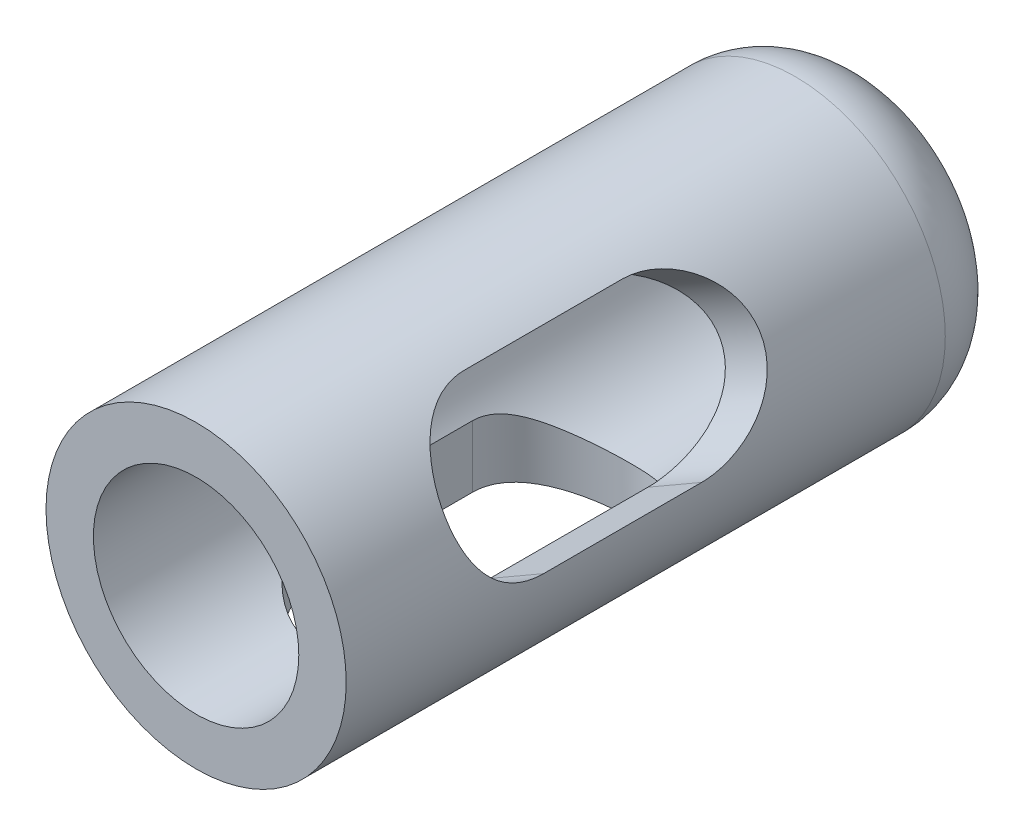
ISO-10303-21;
HEADER;
FILE_DESCRIPTION(('STEP AP214'),'2;1');
FILE_NAME('part.step','',(''),(''),'','','');
FILE_SCHEMA(('AUTOMOTIVE_DESIGN { 1 0 10303 214 1 1 1 1 }'));
ENDSEC;
DATA;
#1=APPLICATION_CONTEXT('core data for automotive mechanical design processes');
#2=APPLICATION_PROTOCOL_DEFINITION('international standard','automotive_design',2000,#1);
#3=PRODUCT_CONTEXT('',#1,'mechanical');
#4=PRODUCT('Part','Part','',(#3));
#5=PRODUCT_RELATED_PRODUCT_CATEGORY('part','',(#4));
#6=PRODUCT_DEFINITION_FORMATION('','',#4);
#7=PRODUCT_DEFINITION_CONTEXT('part definition',#1,'design');
#8=PRODUCT_DEFINITION('design','',#6,#7);
#9=PRODUCT_DEFINITION_SHAPE('','',#8);
#10=(LENGTH_UNIT() NAMED_UNIT(*) SI_UNIT(.MILLI.,.METRE.));
#11=(NAMED_UNIT(*) PLANE_ANGLE_UNIT() SI_UNIT($,.RADIAN.));
#12=(NAMED_UNIT(*) SI_UNIT($,.STERADIAN.) SOLID_ANGLE_UNIT());
#13=UNCERTAINTY_MEASURE_WITH_UNIT(LENGTH_MEASURE(1.E-05),#10,'distance_accuracy_value','');
#14=(GEOMETRIC_REPRESENTATION_CONTEXT(3) GLOBAL_UNCERTAINTY_ASSIGNED_CONTEXT((#13)) GLOBAL_UNIT_ASSIGNED_CONTEXT((#10,
#11,#12)) REPRESENTATION_CONTEXT('',''));
#15=CARTESIAN_POINT('',(0.,0.,0.));
#16=DIRECTION('',(0.,0.,1.));
#17=DIRECTION('',(1.,0.,0.));
#18=AXIS2_PLACEMENT_3D('',#15,#16,#17);
#19=CARTESIAN_POINT('',(0.,0.,17.));
#20=DIRECTION('',(0.,0.,1.));
#21=DIRECTION('',(1.,0.,0.));
#22=AXIS2_PLACEMENT_3D('',#19,#20,#21);
#23=PLANE('',#22);
#24=CARTESIAN_POINT('',(0.,0.,17.));
#25=DIRECTION('',(0.,0.,1.));
#26=DIRECTION('',(1.,0.,0.));
#27=AXIS2_PLACEMENT_3D('',#24,#25,#26);
#28=CIRCLE('',#27,3.8);
#29=CARTESIAN_POINT('',(3.8,0.,17.));
#30=VERTEX_POINT('',#29);
#31=EDGE_CURVE('E164',#30,#30,#28,.T.);
#32=ORIENTED_EDGE('',*,*,#31,.T.);
#33=EDGE_LOOP('',(#32));
#34=FACE_BOUND('',#33,.T.);
#35=CARTESIAN_POINT('',(0.,0.,17.));
#36=DIRECTION('',(0.,0.,1.));
#37=DIRECTION('',(1.,0.,0.));
#38=AXIS2_PLACEMENT_3D('',#35,#36,#37);
#39=CIRCLE('',#38,2.6);
#40=CARTESIAN_POINT('',(2.6,0.,17.));
#41=VERTEX_POINT('',#40);
#42=EDGE_CURVE('E232',#41,#41,#39,.T.);
#43=ORIENTED_EDGE('',*,*,#42,.F.);
#44=EDGE_LOOP('',(#43));
#45=FACE_BOUND('',#44,.T.);
#46=ADVANCED_FACE('F33',(#34,#45),#23,.T.);
#47=CARTESIAN_POINT('',(0.,0.,17.));
#48=DIRECTION('',(0.,0.,-1.));
#49=DIRECTION('',(-1.,0.,0.));
#50=AXIS2_PLACEMENT_3D('',#47,#48,#49);
#51=CYLINDRICAL_SURFACE('',#50,3.8);
#52=CARTESIAN_POINT('',(0.,0.,1.83303027798234));
#53=DIRECTION('',(0.,0.,-1.));
#54=DIRECTION('',(-1.,0.,0.));
#55=AXIS2_PLACEMENT_3D('',#52,#53,#54);
#56=CIRCLE('',#55,3.8);
#57=CARTESIAN_POINT('',(-3.8,0.,1.83303027798234));
#58=VERTEX_POINT('',#57);
#59=EDGE_CURVE('E11',#58,#58,#56,.F.);
#60=ORIENTED_EDGE('',*,*,#59,.T.);
#61=EDGE_LOOP('',(#60));
#62=FACE_BOUND('',#61,.T.);
#63=CARTESIAN_POINT('',(1.79821371592663,3.34760024970924,8.));
#64=CARTESIAN_POINT('',(1.79819423842391,3.34760041602711,7.94805796321496));
#65=CARTESIAN_POINT('',(1.80030960150448,3.34647420937593,7.89612535945052));
#66=CARTESIAN_POINT('',(1.80866130251379,3.34197321799323,7.79272569860866));
#67=CARTESIAN_POINT('',(1.81489478104593,3.33859999345587,7.74125834360507));
#68=CARTESIAN_POINT('',(1.83128277545824,3.32963735199846,7.63948318523699));
#69=CARTESIAN_POINT('',(1.84141242619339,3.32406198308595,7.58917013029526));
#70=CARTESIAN_POINT('',(1.86532855875356,3.31070035449636,7.48972927102245));
#71=CARTESIAN_POINT('',(1.87911552894385,3.30291379954776,7.44060162593673));
#72=CARTESIAN_POINT('',(1.92542931933566,3.27627767526861,7.29571146498947));
#73=CARTESIAN_POINT('',(1.96296743785308,3.25412185532582,7.20209896173194));
#74=CARTESIAN_POINT('',(2.04862491193389,3.20088602893082,7.02250149498523));
#75=CARTESIAN_POINT('',(2.09676251235216,3.16979060621119,6.93653004662085));
#76=CARTESIAN_POINT('',(2.20556153390876,3.09519460979166,6.76610219329466));
#77=CARTESIAN_POINT('',(2.26696486147078,3.05082111269731,6.68249955386298));
#78=CARTESIAN_POINT('',(2.39567485000838,2.95082790416354,6.52741982941529));
#79=CARTESIAN_POINT('',(2.46298323340738,2.89520490518263,6.45594630025168));
#80=CARTESIAN_POINT('',(2.60563655503317,2.76775733839745,6.32173138664337));
#81=CARTESIAN_POINT('',(2.68120164538046,2.69501638745592,6.26008266351592));
#82=CARTESIAN_POINT('',(2.83150058316948,2.53662906968091,6.155011245783));
#83=CARTESIAN_POINT('',(2.90623496494356,2.45099158412313,6.11157608560256));
#84=CARTESIAN_POINT('',(3.04527309176733,2.2754905046588,6.04768424962796));
#85=CARTESIAN_POINT('',(3.1099363865585,2.18646805222747,6.02570831284536));
#86=CARTESIAN_POINT('',(3.23222290170443,2.00125395410131,6.00032211782851));
#87=CARTESIAN_POINT('',(3.28985079262457,1.90506713364042,5.99689947645725));
#88=CARTESIAN_POINT('',(3.39079059863124,1.71834833242358,6.00820808791829));
#89=CARTESIAN_POINT('',(3.43494610057206,1.62816133501499,6.02122621314602));
#90=CARTESIAN_POINT('',(3.51492798964327,1.44742806067806,6.06193418333387));
#91=CARTESIAN_POINT('',(3.55075389789897,1.3568817633975,6.08962487153091));
#92=CARTESIAN_POINT('',(3.61440799149189,1.17698025978526,6.15898545040707));
#93=CARTESIAN_POINT('',(3.64213104177536,1.08765392142999,6.20082510542608));
#94=CARTESIAN_POINT('',(3.68960257092327,0.913766135320814,6.29701690108255));
#95=CARTESIAN_POINT('',(3.70934824094278,0.829206374886347,6.35137343837116));
#96=CARTESIAN_POINT('',(3.74357942331114,0.658724914015943,6.47737224303354));
#97=CARTESIAN_POINT('',(3.75732650630533,0.573538006257285,6.55020975734573));
#98=CARTESIAN_POINT('',(3.7782263327061,0.414107393651125,6.7079600848271));
#99=CARTESIAN_POINT('',(3.78537203946524,0.339875436716998,6.7928856721264));
#100=CARTESIAN_POINT('',(3.79542783670807,0.200032183559709,6.98025666338931));
#101=CARTESIAN_POINT('',(3.79797193991186,0.135515332390023,7.08354544994825));
#102=CARTESIAN_POINT('',(3.80030177122556,0.0264614772099769,7.30005800817536));
#103=CARTESIAN_POINT('',(3.80009482563148,-0.0181282669143184,7.41325459514057));
#104=CARTESIAN_POINT('',(3.79937319145488,-0.0724021267287681,7.60604752506218));
#105=CARTESIAN_POINT('',(3.79898911207107,-0.0888196007511248,7.6837818586023));
#106=CARTESIAN_POINT('',(3.79838565189276,-0.110920778076807,7.84097446056511));
#107=CARTESIAN_POINT('',(3.79816673532284,-0.116574294388115,7.9204369470112));
#108=CARTESIAN_POINT('',(3.79821371592665,-0.116501365428508,8.));
#109=B_SPLINE_CURVE_WITH_KNOTS('',3,(#63,#64,#65,#66,#67,#68,#69,#70,#71,#72,#73,#74,#75,#76,
#77,#78,#79,#80,#81,#82,#83,#84,#85,#86,#87,#88,#89,#90,#91,#92,#93,#94,#95,#96,#97,#98,#99,
#100,#101,#102,#103,#104,#105,#106,#107,#108),.UNSPECIFIED.,.F.,.F.,(4,2,2,2,2,2,2,2,2,2,2,2,2,
2,2,2,2,2,2,2,2,2,4),(0.,0.155755437383611,0.311402840122596,0.466072964289854,
0.620763752108169,0.929111600217882,1.23799441434193,1.57505688132961,1.91221799376904,
2.27528102582129,2.63809516612159,2.97280659857286,3.30729460503788,3.60963550023856,
3.91199377295258,4.2181167564169,4.52434743239993,4.86169680782726,5.19940536272939,
5.56295775837974,5.92554217495209,6.16319099155094,6.40150530652077),.UNSPECIFIED.);
#110=CARTESIAN_POINT('',(1.79821371592663,3.34760024970924,8.));
#111=VERTEX_POINT('',#110);
#112=CARTESIAN_POINT('',(3.79821371592665,-0.116501365428508,8.));
#113=VERTEX_POINT('',#112);
#114=EDGE_CURVE('E114',#111,#113,#109,.T.);
#115=ORIENTED_EDGE('',*,*,#114,.T.);
#116=DIRECTION('',(0.,0.,-1.));
#117=VECTOR('',#116,1.);
#118=CARTESIAN_POINT('',(3.79821371592665,-0.116501365428509,17.));
#119=LINE('',#118,#117);
#120=CARTESIAN_POINT('',(3.79821371592665,-0.116501365428508,12.));
#121=VERTEX_POINT('',#120);
#122=EDGE_CURVE('E106',#113,#121,#119,.F.);
#123=ORIENTED_EDGE('',*,*,#122,.T.);
#124=CARTESIAN_POINT('',(3.79821371592665,-0.116501365428506,12.));
#125=CARTESIAN_POINT('',(3.79820412121079,-0.116518316599598,12.051942036785));
#126=CARTESIAN_POINT('',(3.79828647918124,-0.114123255108009,12.1038746405495));
#127=CARTESIAN_POINT('',(3.79856435680626,-0.104639974177786,12.2072743013913));
#128=CARTESIAN_POINT('',(3.79875979793031,-0.0975550111463293,12.2587416563949));
#129=CARTESIAN_POINT('',(3.79919191994934,-0.0788812709394852,12.360516814763));
#130=CARTESIAN_POINT('',(3.79942833420321,-0.0673210516151264,12.4108298697047));
#131=CARTESIAN_POINT('',(3.79981489068877,-0.039928258962948,12.5102707289775));
#132=CARTESIAN_POINT('',(3.79996502139047,-0.024095115062632,12.5593983740633));
#133=CARTESIAN_POINT('',(3.80005435630227,0.0293318661017971,12.7042885350105));
#134=CARTESIAN_POINT('',(3.79963591264885,0.072918740319549,12.7979010382681));
#135=CARTESIAN_POINT('',(3.79636107163972,0.173718202095038,12.9774985050148));
#136=CARTESIAN_POINT('',(3.79350044583225,0.230954298294296,13.0634699533791));
#137=CARTESIAN_POINT('',(3.78329792869062,0.362475013078966,13.2338978067053));
#138=CARTESIAN_POINT('',(3.77557101673317,0.43783860317175,13.317500446137));
#139=CARTESIAN_POINT('',(3.7533293522058,0.599301327233,13.4725801705847));
#140=CARTESIAN_POINT('',(3.73881261375316,0.68540359663465,13.5440536997483));
#141=CARTESIAN_POINT('',(3.69976644407957,0.872668780489411,13.6782686133566));
#142=CARTESIAN_POINT('',(3.67455347784242,0.974480543840188,13.7399173364841));
#143=CARTESIAN_POINT('',(3.61253550590648,1.18383690101481,13.844988754217));
#144=CARTESIAN_POINT('',(3.57573845878426,1.29137751694617,13.8884239143974));
#145=CARTESIAN_POINT('',(3.49326912898844,1.49953860660232,13.952315750372));
#146=CARTESIAN_POINT('',(3.44850507107131,1.60004988879954,13.9742916871546));
#147=CARTESIAN_POINT('',(3.34924821452799,1.79856016651927,13.9996778821715));
#148=CARTESIAN_POINT('',(3.29476192995967,1.89656079425307,14.0031005235428));
#149=CARTESIAN_POINT('',(3.18352860774504,2.07733663111634,13.9917919120817));
#150=CARTESIAN_POINT('',(3.12750212786858,2.16066991621823,13.978773786854));
#151=CARTESIAN_POINT('',(3.01097346551926,2.32030290116504,13.9380658166661));
#152=CARTESIAN_POINT('',(2.95047102598352,2.39660219646841,13.9103751284691));
#153=CARTESIAN_POINT('',(2.82649880047276,2.54167901038087,13.8410145495929));
#154=CARTESIAN_POINT('',(2.76300144737179,2.61035104537438,13.7991748945739));
#155=CARTESIAN_POINT('',(2.63614597176736,2.73840648862755,13.7029830989174));
#156=CARTESIAN_POINT('',(2.57278790610294,2.79778662069642,13.6486265616288));
#157=CARTESIAN_POINT('',(2.44226222129907,2.9126724246642,13.5226277569665));
#158=CARTESIAN_POINT('',(2.37536173660732,2.96717120164443,13.4497902426543));
#159=CARTESIAN_POINT('',(2.24774068914986,3.06498628854526,13.2920399151729));
#160=CARTESIAN_POINT('',(2.18702678205184,3.10829063059373,13.2071143278736));
#161=CARTESIAN_POINT('',(2.07094687089118,3.18692083303997,13.0197433366107));
#162=CARTESIAN_POINT('',(2.01634569040795,3.22138251662914,12.9164545500517));
#163=CARTESIAN_POINT('',(1.92306719709825,3.27792713732336,12.6999419918246));
#164=CARTESIAN_POINT('',(1.88434787314132,3.30004278924384,12.5867454048594));
#165=CARTESIAN_POINT('',(1.83698451469227,3.32655476562189,12.3939524749378));
#166=CARTESIAN_POINT('',(1.82257452543103,3.33443088012961,12.3162181413977));
#167=CARTESIAN_POINT('',(1.80313261432429,3.34495885694786,12.1590255394349));
#168=CARTESIAN_POINT('',(1.79812706729303,3.34759602779266,12.0795630529888));
#169=CARTESIAN_POINT('',(1.79821371592663,3.34760024970924,12.));
#170=B_SPLINE_CURVE_WITH_KNOTS('',3,(#124,#125,#126,#127,#128,#129,#130,#131,#132,#133,#134,
#135,#136,#137,#138,#139,#140,#141,#142,#143,#144,#145,#146,#147,#148,#149,#150,#151,#152,#153,
#154,#155,#156,#157,#158,#159,#160,#161,#162,#163,#164,#165,#166,#167,#168,#169),.UNSPECIFIED.,
.F.,.F.,(4,2,2,2,2,2,2,2,2,2,2,2,2,2,2,2,2,2,2,2,2,2,4),(0.,0.15575543738361,0.311402840122598,
0.466072964289855,0.620763752108169,0.929111600217882,1.23799441434193,1.57505688132961,
1.91221799376905,2.2752810258213,2.63809516612159,2.97280659857286,3.30729460503788,
3.60963550023856,3.91199377295258,4.2181167564169,4.52434743239993,4.86169680782726,
5.19940536272939,5.56295775837974,5.9255421749521,6.16319099155095,6.40150530652078),.UNSPECIFIED.);
#171=CARTESIAN_POINT('',(1.79821371592663,3.34760024970924,12.));
#172=VERTEX_POINT('',#171);
#173=EDGE_CURVE('E95',#121,#172,#170,.T.);
#174=ORIENTED_EDGE('',*,*,#173,.T.);
#175=DIRECTION('',(0.,0.,-1.));
#176=VECTOR('',#175,1.);
#177=CARTESIAN_POINT('',(1.79821371592663,3.34760024970924,17.));
#178=LINE('',#177,#176);
#179=EDGE_CURVE('E100',#172,#111,#178,.T.);
#180=ORIENTED_EDGE('',*,*,#179,.T.);
#181=EDGE_LOOP('',(#115,#123,#174,#180));
#182=FACE_BOUND('',#181,.T.);
#183=CARTESIAN_POINT('',(2.,-3.2310988842807,8.));
#184=CARTESIAN_POINT('',(2.00000988278686,-3.23108209942748,7.94805796321496));
#185=CARTESIAN_POINT('',(1.99797687767675,-3.2323509542679,7.89612535945052));
#186=CARTESIAN_POINT('',(1.98990305429246,-3.23733324381541,7.79272569860866));
#187=CARTESIAN_POINT('',(1.98386501688436,-3.24104498230951,7.74125834360507));
#188=CARTESIAN_POINT('',(1.96790914449108,-3.25075608105895,7.63948318523698));
#189=CARTESIAN_POINT('',(1.9580159080098,-3.2567409314708,7.58917013029526));
#190=CARTESIAN_POINT('',(1.9344863319352,-3.27077209553339,7.48972927102245));
#191=CARTESIAN_POINT('',(1.9208494924466,-3.2788186844851,7.44060162593673));
#192=CARTESIAN_POINT('',(1.87462503696659,-3.30560954137038,7.29571146498947));
#193=CARTESIAN_POINT('',(1.83666847479575,-3.32704059564534,7.20209896173194));
#194=CARTESIAN_POINT('',(1.74773615970582,-3.37460423102582,7.02250149498523));
#195=CARTESIAN_POINT('',(1.69673793348007,-3.40074490450546,6.93653004662085));
#196=CARTESIAN_POINT('',(1.57773639478184,-3.4576696228706,6.76610219329466));
#197=CARTESIAN_POINT('',(1.50860615526237,-3.48865971586903,6.68249955386298));
#198=CARTESIAN_POINT('',(1.35765450219741,-3.55012923139651,6.52741982941528));
#199=CARTESIAN_POINT('',(1.27582938034577,-3.58060850181725,6.45594630025168));
#200=CARTESIAN_POINT('',(1.09412988904639,-3.64042611888683,6.32173138664337));
#201=CARTESIAN_POINT('',(0.993351832461947,-3.66949693129608,6.26008266351592));
#202=CARTESIAN_POINT('',(0.781034922736991,-3.72046597069568,6.155011245783));
#203=CARTESIAN_POINT('',(0.669503493840695,-3.74236910106927,6.11157608560256));
#204=CARTESIAN_POINT('',(0.447996037221106,-3.77502911126109,6.04768424962796));
#205=CARTESIAN_POINT('',(0.3385686845128,-3.78651794102699,6.02570831284536));
#206=CARTESIAN_POINT('',(0.117025312823558,-3.79981412062055,6.00032211782851));
#207=CARTESIAN_POINT('',(0.00491113733510364,-3.80162792789346,5.99689947645725));
#208=CARTESIAN_POINT('',(-0.207261990886195,-3.79568496353988,6.00820808791829));
#209=CARTESIAN_POINT('',(-0.307443972703479,-3.78883125123319,6.02122621314602));
#210=CARTESIAN_POINT('',(-0.503954524124013,-3.76773096184307,6.06193418333387));
#211=CARTESIAN_POINT('',(-0.600282871915446,-3.75348395986587,6.08962487153091));
#212=CARTESIAN_POINT('',(-0.787909191019123,-3.71865927016609,6.15898545040707));
#213=CARTESIAN_POINT('',(-0.879129594403569,-3.69800496680434,6.20082510542608));
#214=CARTESIAN_POINT('',(-1.0534565991559,-3.65217262394833,6.29701690108255));
#215=CARTESIAN_POINT('',(-1.13656033483983,-3.62699299558274,6.35137343837116));
#216=CARTESIAN_POINT('',(-1.30131720201206,-3.57139733868011,6.47737224303354));
#217=CARTESIAN_POINT('',(-1.38196476969799,-3.54070920790168,6.55020975734573));
#218=CARTESIAN_POINT('',(-1.53048564355623,-3.47909368219635,6.7079600848271));
#219=CARTESIAN_POINT('',(-1.59834525741338,-3.4481660673107,6.7928856721264));
#220=CARTESIAN_POINT('',(-1.72448096581687,-3.38695301659965,6.98025666338931));
#221=CARTESIAN_POINT('',(-1.78162624950389,-3.35689784901914,7.08354544994825));
#222=CARTESIAN_POINT('',(-1.87723457412729,-3.30438861453331,7.30005800817536));
#223=CARTESIAN_POINT('',(-1.91574695249014,-3.28191452232949,7.41325459514057));
#224=CARTESIAN_POINT('',(-1.96238867676259,-3.25415263889309,7.60604752506218));
#225=CARTESIAN_POINT('',(-1.97641458664001,-3.24561127937846,7.6837818586023));
#226=CARTESIAN_POINT('',(-1.99525303756844,-3.23403807887103,7.84097446056511));
#227=CARTESIAN_POINT('',(-2.00003966802979,-3.23102173340452,7.9204369470112));
#228=CARTESIAN_POINT('',(-2.,-3.2310988842807,8.));
#229=B_SPLINE_CURVE_WITH_KNOTS('',3,(#183,#184,#185,#186,#187,#188,#189,#190,#191,#192,#193,
#194,#195,#196,#197,#198,#199,#200,#201,#202,#203,#204,#205,#206,#207,#208,#209,#210,#211,#212,
#213,#214,#215,#216,#217,#218,#219,#220,#221,#222,#223,#224,#225,#226,#227,#228),.UNSPECIFIED.,
.F.,.F.,(4,2,2,2,2,2,2,2,2,2,2,2,2,2,2,2,2,2,2,2,2,2,4),(0.,0.155755437383611,0.311402840122597,
0.466072964289855,0.62076375210817,0.929111600217883,1.23799441434193,1.57505688132961,
1.91221799376905,2.2752810258213,2.63809516612159,2.97280659857286,3.30729460503788,
3.60963550023856,3.91199377295258,4.2181167564169,4.52434743239993,4.86169680782726,
5.19940536272939,5.56295775837974,5.92554217495209,6.16319099155094,6.40150530652078),.UNSPECIFIED.);
#230=CARTESIAN_POINT('',(2.,-3.2310988842807,8.));
#231=VERTEX_POINT('',#230);
#232=CARTESIAN_POINT('',(-2.,-3.2310988842807,8.));
#233=VERTEX_POINT('',#232);
#234=EDGE_CURVE('E240',#231,#233,#229,.T.);
#235=ORIENTED_EDGE('',*,*,#234,.T.);
#236=DIRECTION('',(0.,0.,-1.));
#237=VECTOR('',#236,1.);
#238=CARTESIAN_POINT('',(-2.,-3.2310988842807,17.));
#239=LINE('',#238,#237);
#240=CARTESIAN_POINT('',(-2.,-3.2310988842807,12.));
#241=VERTEX_POINT('',#240);
#242=EDGE_CURVE('E237',#233,#241,#239,.F.);
#243=ORIENTED_EDGE('',*,*,#242,.T.);
#244=CARTESIAN_POINT('',(-2.,-3.2310988842807,12.));
#245=CARTESIAN_POINT('',(-2.00000988278686,-3.23108209942748,12.051942036785));
#246=CARTESIAN_POINT('',(-1.99797687767675,-3.2323509542679,12.1038746405495));
#247=CARTESIAN_POINT('',(-1.98990305429246,-3.23733324381541,12.2072743013913));
#248=CARTESIAN_POINT('',(-1.98386501688436,-3.24104498230951,12.2587416563949));
#249=CARTESIAN_POINT('',(-1.96790914449108,-3.25075608105895,12.360516814763));
#250=CARTESIAN_POINT('',(-1.9580159080098,-3.2567409314708,12.4108298697047));
#251=CARTESIAN_POINT('',(-1.9344863319352,-3.27077209553339,12.5102707289775));
#252=CARTESIAN_POINT('',(-1.9208494924466,-3.2788186844851,12.5593983740633));
#253=CARTESIAN_POINT('',(-1.87462503696659,-3.30560954137038,12.7042885350105));
#254=CARTESIAN_POINT('',(-1.83666847479575,-3.32704059564534,12.7979010382681));
#255=CARTESIAN_POINT('',(-1.74773615970582,-3.37460423102582,12.9774985050148));
#256=CARTESIAN_POINT('',(-1.69673793348007,-3.40074490450546,13.0634699533791));
#257=CARTESIAN_POINT('',(-1.57773639478184,-3.4576696228706,13.2338978067053));
#258=CARTESIAN_POINT('',(-1.50860615526237,-3.48865971586903,13.317500446137));
#259=CARTESIAN_POINT('',(-1.35765450219741,-3.55012923139651,13.4725801705847));
#260=CARTESIAN_POINT('',(-1.27582938034577,-3.58060850181725,13.5440536997483));
#261=CARTESIAN_POINT('',(-1.09412988904639,-3.64042611888683,13.6782686133566));
#262=CARTESIAN_POINT('',(-0.993351832461947,-3.66949693129608,13.7399173364841));
#263=CARTESIAN_POINT('',(-0.781034922736991,-3.72046597069568,13.844988754217));
#264=CARTESIAN_POINT('',(-0.669503493840695,-3.74236910106927,13.8884239143974));
#265=CARTESIAN_POINT('',(-0.447996037221105,-3.77502911126109,13.952315750372));
#266=CARTESIAN_POINT('',(-0.3385686845128,-3.78651794102699,13.9742916871546));
#267=CARTESIAN_POINT('',(-0.117025312823558,-3.79981412062055,13.9996778821715));
#268=CARTESIAN_POINT('',(-0.00491113733510366,-3.80162792789346,14.0031005235428));
#269=CARTESIAN_POINT('',(0.207261990886194,-3.79568496353988,13.9917919120817));
#270=CARTESIAN_POINT('',(0.307443972703478,-3.78883125123319,13.978773786854));
#271=CARTESIAN_POINT('',(0.503954524124013,-3.76773096184307,13.9380658166661));
#272=CARTESIAN_POINT('',(0.600282871915445,-3.75348395986587,13.9103751284691));
#273=CARTESIAN_POINT('',(0.787909191019123,-3.71865927016609,13.8410145495929));
#274=CARTESIAN_POINT('',(0.879129594403568,-3.69800496680434,13.7991748945739));
#275=CARTESIAN_POINT('',(1.0534565991559,-3.65217262394833,13.7029830989174));
#276=CARTESIAN_POINT('',(1.13656033483983,-3.62699299558274,13.6486265616288));
#277=CARTESIAN_POINT('',(1.30131720201206,-3.57139733868011,13.5226277569665));
#278=CARTESIAN_POINT('',(1.38196476969799,-3.54070920790168,13.4497902426543));
#279=CARTESIAN_POINT('',(1.53048564355623,-3.47909368219635,13.2920399151729));
#280=CARTESIAN_POINT('',(1.59834525741338,-3.4481660673107,13.2071143278736));
#281=CARTESIAN_POINT('',(1.72448096581687,-3.38695301659965,13.0197433366107));
#282=CARTESIAN_POINT('',(1.78162624950389,-3.35689784901914,12.9164545500518));
#283=CARTESIAN_POINT('',(1.87723457412729,-3.30438861453331,12.6999419918246));
#284=CARTESIAN_POINT('',(1.91574695249014,-3.28191452232949,12.5867454048594));
#285=CARTESIAN_POINT('',(1.96238867676259,-3.25415263889309,12.3939524749378));
#286=CARTESIAN_POINT('',(1.97641458664001,-3.24561127937846,12.3162181413977));
#287=CARTESIAN_POINT('',(1.99525303756844,-3.23403807887103,12.1590255394349));
#288=CARTESIAN_POINT('',(2.00003966802979,-3.23102173340452,12.0795630529888));
#289=CARTESIAN_POINT('',(2.,-3.2310988842807,12.));
#290=B_SPLINE_CURVE_WITH_KNOTS('',3,(#244,#245,#246,#247,#248,#249,#250,#251,#252,#253,#254,
#255,#256,#257,#258,#259,#260,#261,#262,#263,#264,#265,#266,#267,#268,#269,#270,#271,#272,#273,
#274,#275,#276,#277,#278,#279,#280,#281,#282,#283,#284,#285,#286,#287,#288,#289),.UNSPECIFIED.,
.F.,.F.,(4,2,2,2,2,2,2,2,2,2,2,2,2,2,2,2,2,2,2,2,2,2,4),(0.,0.155755437383611,0.311402840122598,
0.466072964289855,0.62076375210817,0.929111600217882,1.23799441434193,1.57505688132961,
1.91221799376905,2.2752810258213,2.63809516612159,2.97280659857286,3.30729460503788,
3.60963550023856,3.91199377295258,4.2181167564169,4.52434743239993,4.86169680782726,
5.19940536272939,5.56295775837973,5.92554217495209,6.16319099155094,6.40150530652077),.UNSPECIFIED.);
#291=CARTESIAN_POINT('',(2.,-3.2310988842807,12.));
#292=VERTEX_POINT('',#291);
#293=EDGE_CURVE('E129',#241,#292,#290,.T.);
#294=ORIENTED_EDGE('',*,*,#293,.T.);
#295=DIRECTION('',(0.,0.,-1.));
#296=VECTOR('',#295,1.);
#297=CARTESIAN_POINT('',(2.,-3.2310988842807,17.));
#298=LINE('',#297,#296);
#299=EDGE_CURVE('E141',#292,#231,#298,.T.);
#300=ORIENTED_EDGE('',*,*,#299,.T.);
#301=EDGE_LOOP('',(#235,#243,#294,#300));
#302=FACE_BOUND('',#301,.T.);
#303=ORIENTED_EDGE('',*,*,#31,.F.);
#304=EDGE_LOOP('',(#303));
#305=FACE_BOUND('',#304,.T.);
#306=ADVANCED_FACE('F112',(#62,#182,#302,#305),#51,.T.);
#307=CARTESIAN_POINT('',(0.,0.,17.));
#308=DIRECTION('',(0.,0.,-1.));
#309=DIRECTION('',(-1.,0.,0.));
#310=AXIS2_PLACEMENT_3D('',#307,#308,#309);
#311=CYLINDRICAL_SURFACE('',#310,2.6);
#312=DIRECTION('',(0.,0.,-1.));
#313=VECTOR('',#312,1.);
#314=CARTESIAN_POINT('',(2.43874945699382,-0.901388421277059,17.));
#315=LINE('',#314,#313);
#316=CARTESIAN_POINT('',(2.43874945699382,-0.901388421277058,8.));
#317=VERTEX_POINT('',#316);
#318=CARTESIAN_POINT('',(2.43874945699382,-0.901388421277056,12.));
#319=VERTEX_POINT('',#318);
#320=EDGE_CURVE('E41',#317,#319,#315,.F.);
#321=ORIENTED_EDGE('',*,*,#320,.F.);
#322=CARTESIAN_POINT('',(0.438749456993804,2.56271319386069,8.));
#323=CARTESIAN_POINT('',(0.438705501046726,2.56270632442625,7.95334565374482));
#324=CARTESIAN_POINT('',(0.441266376025686,2.56228225834433,7.9067210026695));
#325=CARTESIAN_POINT('',(0.451246835246769,2.56055094923277,7.81412268191776));
#326=CARTESIAN_POINT('',(0.45865443812744,2.55924588382702,7.7681476918181));
#327=CARTESIAN_POINT('',(0.477840547599988,2.55572990900256,7.67786456768146));
#328=CARTESIAN_POINT('',(0.489554174821539,2.55353239715037,7.63354193456711));
#329=CARTESIAN_POINT('',(0.516848706690962,2.54814901782238,7.54615434468212));
#330=CARTESIAN_POINT('',(0.532432180768708,2.5449624933275,7.50309024484806));
#331=CARTESIAN_POINT('',(0.591791663177842,2.53211822126285,7.35736468019374));
#332=CARTESIAN_POINT('',(0.643831827843118,2.51975260402823,7.25825483491137));
#333=CARTESIAN_POINT('',(0.760971199762619,2.48689584131393,7.0690824441933));
#334=CARTESIAN_POINT('',(0.826149422852428,2.46635476065721,6.97907984335389));
#335=CARTESIAN_POINT('',(0.966251856518772,2.41496689798607,6.80654475501954));
#336=CARTESIAN_POINT('',(1.04136995180174,2.38388808847066,6.72423900832425));
#337=CARTESIAN_POINT('',(1.19630165737005,2.31002560664521,6.5702424110662));
#338=CARTESIAN_POINT('',(1.27610627972866,2.26726379957135,6.49853211316592));
#339=CARTESIAN_POINT('',(1.43393535584574,2.17071889342609,6.36970134399645));
#340=CARTESIAN_POINT('',(1.51188975873245,2.11748599185668,6.31208770163726));
#341=CARTESIAN_POINT('',(1.66638690892551,1.99816188755709,6.20956329905179));
#342=CARTESIAN_POINT('',(1.74293063871708,1.93208003517259,6.16464335942469));
#343=CARTESIAN_POINT('',(1.88004354376139,1.79810770855173,6.09545850865267));
#344=CARTESIAN_POINT('',(1.94128196994495,1.73198983689564,6.06910127052194));
#345=CARTESIAN_POINT('',(2.05803790018709,1.59147832171106,6.02857204199065));
#346=CARTESIAN_POINT('',(2.1135592375822,1.51709029388363,6.01439183938468));
#347=CARTESIAN_POINT('',(2.21693994726696,1.36158594057967,5.99905886297198));
#348=CARTESIAN_POINT('',(2.26477697388247,1.28045099776803,5.99794342797047));
#349=CARTESIAN_POINT('',(2.35104172970342,1.11417166495908,6.0089131094789));
#350=CARTESIAN_POINT('',(2.38946805164444,1.029026677572,6.02100019880323));
#351=CARTESIAN_POINT('',(2.45481842972056,0.861185661120496,6.05681665947194));
#352=CARTESIAN_POINT('',(2.48216249760988,0.778539678120211,6.08002851971832));
#353=CARTESIAN_POINT('',(2.52782493782205,0.614308447554042,6.13668671471201));
#354=CARTESIAN_POINT('',(2.54614101616474,0.532723474709054,6.17013564716701));
#355=CARTESIAN_POINT('',(2.57597503883456,0.363937338010569,6.24998378113058));
#356=CARTESIAN_POINT('',(2.58657594310278,0.277047357186876,6.2973747101724));
#357=CARTESIAN_POINT('',(2.5991141105675,0.10846358254839,6.40156532270663));
#358=CARTESIAN_POINT('',(2.60104609706367,0.0267729833665595,6.45837071490191));
#359=CARTESIAN_POINT('',(2.59761476360077,-0.145815728095658,6.59252122017785));
#360=CARTESIAN_POINT('',(2.59070490196845,-0.235257924757259,6.67169921246126));
#361=CARTESIAN_POINT('',(2.57004391911486,-0.402450143201462,6.8410271059125));
#362=CARTESIAN_POINT('',(2.55628246753695,-0.480182278133399,6.93119341900754));
#363=CARTESIAN_POINT('',(2.52844312351287,-0.608721548409059,7.10603779741167));
#364=CARTESIAN_POINT('',(2.51481177635535,-0.661858904580375,7.18906800593248));
#365=CARTESIAN_POINT('',(2.48854289872108,-0.754630439984123,7.36210992515783));
#366=CARTESIAN_POINT('',(2.47590024676963,-0.794338318706704,7.45208008997842));
#367=CARTESIAN_POINT('',(2.45737433194047,-0.849694857073376,7.61778149857062));
#368=CARTESIAN_POINT('',(2.45061411781075,-0.868724607204168,7.69225200440987));
#369=CARTESIAN_POINT('',(2.44361738118792,-0.888132846086311,7.80612179001139));
#370=CARTESIAN_POINT('',(2.4418078975578,-0.893081107149879,7.84467106054858));
#371=CARTESIAN_POINT('',(2.43936737946993,-0.899717792540401,7.92213910370433));
#372=CARTESIAN_POINT('',(2.43873800631322,-0.901401621474491,7.9610583198191));
#373=CARTESIAN_POINT('',(2.43874945699383,-0.901388421277057,8.));
#374=B_SPLINE_CURVE_WITH_KNOTS('',3,(#322,#323,#324,#325,#326,#327,#328,#329,#330,#331,#332,
#333,#334,#335,#336,#337,#338,#339,#340,#341,#342,#343,#344,#345,#346,#347,#348,#349,#350,#351,
#352,#353,#354,#355,#356,#357,#358,#359,#360,#361,#362,#363,#364,#365,#366,#367,#368,#369,#370,
#371,#372,#373),.UNSPECIFIED.,.F.,.F.,(4,2,2,2,2,2,2,2,2,2,2,2,2,2,2,2,2,2,2,2,2,2,2,2,2,4),(0.,
0.139843247280925,0.279342094365777,0.416819917271656,0.554389265384176,0.890216593014791,
1.22812740803072,1.57402209428073,1.91927380644922,2.24974513775387,2.57997687487046,
2.86045345161476,3.14074072577915,3.42182885971326,3.7029590015673,3.97212154710019,
4.24135245067013,4.53888550395635,4.83659963866611,5.19423290198161,5.55240702052978,
5.85004784113604,6.14602768143714,6.3764419770333,6.49302137573995,6.6097647662909),.UNSPECIFIED.);
#375=CARTESIAN_POINT('',(0.438749456993797,2.56271319386068,8.));
#376=VERTEX_POINT('',#375);
#377=EDGE_CURVE('E209',#376,#317,#374,.T.);
#378=ORIENTED_EDGE('',*,*,#377,.F.);
#379=DIRECTION('',(0.,0.,-1.));
#380=VECTOR('',#379,1.);
#381=CARTESIAN_POINT('',(0.438749456993802,2.56271319386069,17.));
#382=LINE('',#381,#380);
#383=CARTESIAN_POINT('',(0.438749456993804,2.56271319386069,12.));
#384=VERTEX_POINT('',#383);
#385=EDGE_CURVE('E187',#384,#376,#382,.T.);
#386=ORIENTED_EDGE('',*,*,#385,.F.);
#387=CARTESIAN_POINT('',(2.43874945699382,-0.901388421277056,12.));
#388=CARTESIAN_POINT('',(2.43872152991555,-0.901423053526657,12.0466543462552));
#389=CARTESIAN_POINT('',(2.43963471540521,-0.898993237698002,12.0932789973305));
#390=CARTESIAN_POINT('',(2.44312558734333,-0.889484251915331,12.1858773180822));
#391=CARTESIAN_POINT('',(2.44569916898869,-0.882416546936647,12.2318523081819));
#392=CARTESIAN_POINT('',(2.45224730020791,-0.864042901321398,12.3221354323185));
#393=CARTESIAN_POINT('',(2.45620101272957,-0.85279984665098,12.3664580654329));
#394=CARTESIAN_POINT('',(2.46518613540804,-0.826470399003661,12.4538456553179));
#395=CARTESIAN_POINT('',(2.47021826128457,-0.811381452325675,12.4969097551519));
#396=CARTESIAN_POINT('',(2.48877453658802,-0.753552496571539,12.6426353198063));
#397=CARTESIAN_POINT('',(2.50408568026201,-0.702301583336982,12.7417451650886));
#398=CARTESIAN_POINT('',(2.53420057502505,-0.584427530114188,12.9309175558067));
#399=CARTESIAN_POINT('',(2.54900058890005,-0.517710992816524,13.0209201566461));
#400=CARTESIAN_POINT('',(2.57454861121383,-0.370684794793871,13.1934552449805));
#401=CARTESIAN_POINT('',(2.58519262029559,-0.29009121123722,13.2757609916757));
#402=CARTESIAN_POINT('',(2.59869168743234,-0.118985177450684,13.4297575889338));
#403=CARTESIAN_POINT('',(2.60156118737394,-0.02849144361178,13.5014678868341));
#404=CARTESIAN_POINT('',(2.59686538410471,0.156464998834072,13.6302986560036));
#405=CARTESIAN_POINT('',(2.5897415404718,0.250591942855521,13.6879122983627));
#406=CARTESIAN_POINT('',(2.56365240996105,0.444052451884802,13.7904367009482));
#407=CARTESIAN_POINT('',(2.54469571196273,0.543382192576962,13.8353566405753));
#408=CARTESIAN_POINT('',(2.49722872622712,0.729111614842447,13.9045414913473));
#409=CARTESIAN_POINT('',(2.47058818282055,0.815204583433234,13.9308987294781));
#410=CARTESIAN_POINT('',(2.40727960626754,0.986573942657694,13.9714279580094));
#411=CARTESIAN_POINT('',(2.37061835312911,1.07185084520766,13.9856081606153));
#412=CARTESIAN_POINT('',(2.28763798761119,1.23913334270791,14.000941137028));
#413=CARTESIAN_POINT('',(2.24129157930947,1.32112889440427,14.0020565720295));
#414=CARTESIAN_POINT('',(2.14042183088306,1.47897603080095,13.9910868905211));
#415=CARTESIAN_POINT('',(2.08589726977145,1.55482669546941,13.9789998011968));
#416=CARTESIAN_POINT('',(1.97321787476551,1.69534229125601,13.9431833405281));
#417=CARTESIAN_POINT('',(1.91531638791118,1.7603459401911,13.9199714802817));
#418=CARTESIAN_POINT('',(1.79591919025219,1.88200638869671,13.863313285288));
#419=CARTESIAN_POINT('',(1.73442257037271,1.93866106426168,13.829864352833));
#420=CARTESIAN_POINT('',(1.60316649952009,2.04889115414006,13.7500162188694));
#421=CARTESIAN_POINT('',(1.53321802092654,2.10151679695128,13.7026252898276));
#422=CARTESIAN_POINT('',(1.3934892731561,2.19666705581187,13.5984346772934));
#423=CARTESIAN_POINT('',(1.32370913226235,2.23918550478824,13.5416292850981));
#424=CARTESIAN_POINT('',(1.1725272569982,2.32250823857161,13.4074787798221));
#425=CARTESIAN_POINT('',(1.09161311170281,2.36124522119219,13.3283007875387));
#426=CARTESIAN_POINT('',(0.936489911788255,2.42694839439593,13.1589728940875));
#427=CARTESIAN_POINT('',(0.862291182457838,2.45389669520247,13.0688065809925));
#428=CARTESIAN_POINT('',(0.737053237003164,2.49405675119075,12.8939622025883));
#429=CARTESIAN_POINT('',(0.684219263090106,2.5088203363502,12.8109319940675));
#430=CARTESIAN_POINT('',(0.590742317865238,2.53245658869189,12.6378900748422));
#431=CARTESIAN_POINT('',(0.550032960185363,2.54136167029202,12.5479199100216));
#432=CARTESIAN_POINT('',(0.492829834279681,2.55299602660496,12.3822185014294));
#433=CARTESIAN_POINT('',(0.472969480173887,2.55665638449899,12.3077479955901));
#434=CARTESIAN_POINT('',(0.452663083947818,2.5603011522811,12.1938782099886));
#435=CARTESIAN_POINT('',(0.447473022347148,2.56120822402147,12.1553289394514));
#436=CARTESIAN_POINT('',(0.440505225158092,2.56241301605424,12.0778608962957));
#437=CARTESIAN_POINT('',(0.438732299947192,2.56270987737912,12.0389416801809));
#438=CARTESIAN_POINT('',(0.438749456993809,2.56271319386069,12.));
#439=B_SPLINE_CURVE_WITH_KNOTS('',3,(#387,#388,#389,#390,#391,#392,#393,#394,#395,#396,#397,
#398,#399,#400,#401,#402,#403,#404,#405,#406,#407,#408,#409,#410,#411,#412,#413,#414,#415,#416,
#417,#418,#419,#420,#421,#422,#423,#424,#425,#426,#427,#428,#429,#430,#431,#432,#433,#434,#435,
#436,#437,#438),.UNSPECIFIED.,.F.,.F.,(4,2,2,2,2,2,2,2,2,2,2,2,2,2,2,2,2,2,2,2,2,2,2,2,2,4),(0.,
0.139843247280925,0.279342094365775,0.416819917271655,0.554389265384177,0.89021659301479,
1.22812740803072,1.57402209428073,1.91927380644922,2.24974513775387,2.57997687487046,
2.86045345161476,3.14074072577915,3.42182885971326,3.7029590015673,3.97212154710019,
4.24135245067013,4.53888550395635,4.83659963866612,5.19423290198161,5.55240702052979,
5.85004784113604,6.14602768143714,6.3764419770333,6.49302137573995,6.6097647662909),.UNSPECIFIED.);
#440=EDGE_CURVE('E181',#319,#384,#439,.T.);
#441=ORIENTED_EDGE('',*,*,#440,.F.);
#442=EDGE_LOOP('',(#321,#378,#386,#441));
#443=FACE_BOUND('',#442,.T.);
#444=DIRECTION('',(0.,0.,-1.));
#445=VECTOR('',#444,1.);
#446=CARTESIAN_POINT('',(-2.,-1.66132477258361,17.));
#447=LINE('',#446,#445);
#448=CARTESIAN_POINT('',(-2.,-1.66132477258361,8.));
#449=VERTEX_POINT('',#448);
#450=CARTESIAN_POINT('',(-2.,-1.66132477258361,12.));
#451=VERTEX_POINT('',#450);
#452=EDGE_CURVE('E188',#449,#451,#447,.F.);
#453=ORIENTED_EDGE('',*,*,#452,.F.);
#454=CARTESIAN_POINT('',(2.,-1.66132477258361,8.));
#455=CARTESIAN_POINT('',(2.00001602886881,-1.66128327089958,7.95334565374482));
#456=CARTESIAN_POINT('',(1.9983683393795,-1.66328902064632,7.9067210026695));
#457=CARTESIAN_POINT('',(1.99187875209655,-1.67106669731743,7.81412268191776));
#458=CARTESIAN_POINT('',(1.98704473086123,-1.67682933689036,7.76814769181809));
#459=CARTESIAN_POINT('',(1.9744067526079,-1.69168700768114,7.67786456768146));
#460=CARTESIAN_POINT('',(1.96664683790802,-1.70073255049938,7.63354193456711));
#461=CARTESIAN_POINT('',(1.94833742871706,-1.72167861881871,7.54615434468212));
#462=CARTESIAN_POINT('',(1.93778608051584,-1.73358104100181,7.50309024484805));
#463=CARTESIAN_POINT('',(1.89698287341016,-1.77856572469129,7.35736468019374));
#464=CARTESIAN_POINT('',(1.86025385241887,-1.81745102069124,7.25825483491137));
#465=CARTESIAN_POINT('',(1.77322937526241,-1.90246831119972,7.0690824441933));
#466=CARTESIAN_POINT('',(1.72285116604761,-1.94864376784067,6.97907984335389));
#467=CARTESIAN_POINT('',(1.60829675469504,-2.04428210319218,6.80654475501954));
#468=CARTESIAN_POINT('',(1.54382266849383,-2.09379687723342,6.72423900832425));
#469=CARTESIAN_POINT('',(1.40239003006227,-2.19104042919451,6.5702424110662));
#470=CARTESIAN_POINT('',(1.32545490764527,-2.23877235595955,6.49853211316592));
#471=CARTESIAN_POINT('',(1.16293002825895,-2.32718389226014,6.36970134399645));
#472=CARTESIAN_POINT('',(1.07785178173933,-2.36807793471218,6.31208770163726));
#473=CARTESIAN_POINT('',(0.897265501035533,-2.44221433944187,6.20956329905178));
#474=CARTESIAN_POINT('',(0.80176507324564,-2.47546222774953,6.16464335942469));
#475=CARTESIAN_POINT('',(0.617185182465715,-2.52721932339416,6.09545850865267));
#476=CARTESIAN_POINT('',(0.529306212875597,-2.54719442032885,6.06910127052193));
#477=CARTESIAN_POINT('',(0.349241706080445,-2.57805226436873,6.02857204199065));
#478=CARTESIAN_POINT('',(0.25705911554691,-2.58894113909127,6.01439183938468));
#479=CARTESIAN_POINT('',(0.0706980403442247,-2.60071928328756,5.99905886297198));
#480=CARTESIAN_POINT('',(-0.0234853945730024,-2.60157989217228,5.99794342797047));
#481=CARTESIAN_POINT('',(-0.210619898820359,-2.59314769576001,6.0089131094789));
#482=CARTESIAN_POINT('',(-0.303570781872982,-2.58385337304139,6.02100019880323));
#483=CARTESIAN_POINT('',(-0.48160055495505,-2.55652795237648,6.05681665947194));
#484=CARTESIAN_POINT('',(-0.566846109698691,-2.53888561831129,6.08002851971832));
#485=CARTESIAN_POINT('',(-0.731905747569858,-2.49631483625073,6.13668671471201));
#486=CARTESIAN_POINT('',(-0.811718445792028,-2.47138453897072,6.17013564716702));
#487=CARTESIAN_POINT('',(-0.972808539314454,-2.41282849215061,6.24998378113058));
#488=CARTESIAN_POINT('',(-1.05335792217623,-2.37856415413813,6.2973747101724));
#489=CARTESIAN_POINT('',(-1.20562483741139,-2.30513063836024,6.40156532270663));
#490=CARTESIAN_POINT('',(-1.27733696480131,-2.26595848815478,6.45837071490191));
#491=CARTESIAN_POINT('',(-1.42508750660256,-2.17669251047594,6.59252122017785));
#492=CARTESIAN_POINT('',(-1.49909179026563,-2.12598729643491,6.67169921246126));
#493=CARTESIAN_POINT('',(-1.63355400732659,-2.02449825119445,6.8410271059125));
#494=CARTESIAN_POINT('',(-1.69399128507909,-1.97371441706906,6.93119341900754));
#495=CARTESIAN_POINT('',(-1.79138988650969,-1.88533520278168,7.10603779741167));
#496=CARTESIAN_POINT('',(-1.83059251326523,-1.84696143176981,7.18906800593248));
#497=CARTESIAN_POINT('',(-1.89780058085583,-1.77782614870775,7.36210992515783));
#498=CARTESIAN_POINT('',(-1.92586728658425,-1.7470233515853,7.45208008997842));
#499=CARTESIAN_POINT('',(-1.96454449766078,-1.70330116953157,7.61778149857063));
#500=CARTESIAN_POINT('',(-1.97764463763685,-1.68793177729481,7.69225200440987));
#501=CARTESIAN_POINT('',(-1.99095429724009,-1.67216830619478,7.80612179001139));
#502=CARTESIAN_POINT('',(-1.99433487521063,-1.66812711687158,7.84467106054858));
#503=CARTESIAN_POINT('',(-1.99886215431182,-1.66269522351382,7.92213910370433));
#504=CARTESIAN_POINT('',(-2.00000570636601,-1.66130825590461,7.9610583198191));
#505=CARTESIAN_POINT('',(-2.,-1.66132477258362,8.));
#506=B_SPLINE_CURVE_WITH_KNOTS('',3,(#454,#455,#456,#457,#458,#459,#460,#461,#462,#463,#464,
#465,#466,#467,#468,#469,#470,#471,#472,#473,#474,#475,#476,#477,#478,#479,#480,#481,#482,#483,
#484,#485,#486,#487,#488,#489,#490,#491,#492,#493,#494,#495,#496,#497,#498,#499,#500,#501,#502,
#503,#504,#505),.UNSPECIFIED.,.F.,.F.,(4,2,2,2,2,2,2,2,2,2,2,2,2,2,2,2,2,2,2,2,2,2,2,2,2,4),(0.,
0.139843247280927,0.279342094365778,0.416819917271658,0.554389265384178,0.890216593014793,
1.22812740803072,1.57402209428073,1.91927380644922,2.24974513775387,2.57997687487046,
2.86045345161476,3.14074072577915,3.42182885971326,3.7029590015673,3.97212154710019,
4.24135245067013,4.53888550395635,4.83659963866612,5.19423290198161,5.55240702052978,
5.85004784113604,6.14602768143714,6.3764419770333,6.49302137573995,6.6097647662909),.UNSPECIFIED.);
#507=CARTESIAN_POINT('',(2.,-1.66132477258362,8.));
#508=VERTEX_POINT('',#507);
#509=EDGE_CURVE('E175',#508,#449,#506,.T.);
#510=ORIENTED_EDGE('',*,*,#509,.F.);
#511=DIRECTION('',(0.,0.,-1.));
#512=VECTOR('',#511,1.);
#513=CARTESIAN_POINT('',(2.,-1.66132477258361,17.));
#514=LINE('',#513,#512);
#515=CARTESIAN_POINT('',(2.,-1.66132477258361,12.));
#516=VERTEX_POINT('',#515);
#517=EDGE_CURVE('E163',#516,#508,#514,.T.);
#518=ORIENTED_EDGE('',*,*,#517,.F.);
#519=CARTESIAN_POINT('',(-2.,-1.66132477258361,12.));
#520=CARTESIAN_POINT('',(-2.00001602886881,-1.66128327089958,12.0466543462552));
#521=CARTESIAN_POINT('',(-1.9983683393795,-1.66328902064632,12.0932789973305));
#522=CARTESIAN_POINT('',(-1.99187875209655,-1.67106669731743,12.1858773180822));
#523=CARTESIAN_POINT('',(-1.98704473086123,-1.67682933689036,12.2318523081819));
#524=CARTESIAN_POINT('',(-1.9744067526079,-1.69168700768114,12.3221354323185));
#525=CARTESIAN_POINT('',(-1.96664683790802,-1.70073255049938,12.3664580654329));
#526=CARTESIAN_POINT('',(-1.94833742871706,-1.72167861881871,12.4538456553179));
#527=CARTESIAN_POINT('',(-1.93778608051584,-1.73358104100181,12.4969097551519));
#528=CARTESIAN_POINT('',(-1.89698287341016,-1.77856572469129,12.6426353198063));
#529=CARTESIAN_POINT('',(-1.86025385241887,-1.81745102069124,12.7417451650886));
#530=CARTESIAN_POINT('',(-1.77322937526241,-1.90246831119972,12.9309175558067));
#531=CARTESIAN_POINT('',(-1.72285116604761,-1.94864376784067,13.0209201566461));
#532=CARTESIAN_POINT('',(-1.60829675469504,-2.04428210319218,13.1934552449805));
#533=CARTESIAN_POINT('',(-1.54382266849384,-2.09379687723342,13.2757609916757));
#534=CARTESIAN_POINT('',(-1.40239003006227,-2.19104042919451,13.4297575889338));
#535=CARTESIAN_POINT('',(-1.32545490764528,-2.23877235595955,13.5014678868341));
#536=CARTESIAN_POINT('',(-1.16293002825896,-2.32718389226014,13.6302986560036));
#537=CARTESIAN_POINT('',(-1.07785178173933,-2.36807793471218,13.6879122983627));
#538=CARTESIAN_POINT('',(-0.897265501035535,-2.44221433944187,13.7904367009482));
#539=CARTESIAN_POINT('',(-0.801765073245643,-2.47546222774953,13.8353566405753));
#540=CARTESIAN_POINT('',(-0.617185182465718,-2.52721932339416,13.9045414913473));
#541=CARTESIAN_POINT('',(-0.5293062128756,-2.54719442032885,13.9308987294781));
#542=CARTESIAN_POINT('',(-0.349241706080448,-2.57805226436873,13.9714279580094));
#543=CARTESIAN_POINT('',(-0.257059115546913,-2.58894113909127,13.9856081606153));
#544=CARTESIAN_POINT('',(-0.0706980403442272,-2.60071928328756,14.000941137028));
#545=CARTESIAN_POINT('',(0.023485394573,-2.60157989217228,14.0020565720295));
#546=CARTESIAN_POINT('',(0.210619898820356,-2.59314769576001,13.9910868905211));
#547=CARTESIAN_POINT('',(0.30357078187298,-2.58385337304139,13.9789998011968));
#548=CARTESIAN_POINT('',(0.481600554955048,-2.55652795237648,13.9431833405281));
#549=CARTESIAN_POINT('',(0.566846109698688,-2.53888561831129,13.9199714802817));
#550=CARTESIAN_POINT('',(0.731905747569856,-2.49631483625073,13.863313285288));
#551=CARTESIAN_POINT('',(0.811718445792026,-2.47138453897072,13.829864352833));
#552=CARTESIAN_POINT('',(0.972808539314453,-2.41282849215061,13.7500162188694));
#553=CARTESIAN_POINT('',(1.05335792217622,-2.37856415413813,13.7026252898276));
#554=CARTESIAN_POINT('',(1.20562483741139,-2.30513063836024,13.5984346772934));
#555=CARTESIAN_POINT('',(1.27733696480131,-2.26595848815478,13.5416292850981));
#556=CARTESIAN_POINT('',(1.42508750660256,-2.17669251047594,13.4074787798221));
#557=CARTESIAN_POINT('',(1.49909179026563,-2.12598729643491,13.3283007875387));
#558=CARTESIAN_POINT('',(1.63355400732659,-2.02449825119445,13.1589728940875));
#559=CARTESIAN_POINT('',(1.69399128507909,-1.97371441706906,13.0688065809925));
#560=CARTESIAN_POINT('',(1.79138988650969,-1.88533520278168,12.8939622025883));
#561=CARTESIAN_POINT('',(1.83059251326523,-1.84696143176981,12.8109319940675));
#562=CARTESIAN_POINT('',(1.89780058085583,-1.77782614870775,12.6378900748422));
#563=CARTESIAN_POINT('',(1.92586728658425,-1.7470233515853,12.5479199100216));
#564=CARTESIAN_POINT('',(1.96454449766078,-1.70330116953157,12.3822185014294));
#565=CARTESIAN_POINT('',(1.97764463763685,-1.68793177729481,12.3077479955901));
#566=CARTESIAN_POINT('',(1.99095429724009,-1.67216830619478,12.1938782099886));
#567=CARTESIAN_POINT('',(1.99433487521063,-1.66812711687158,12.1553289394514));
#568=CARTESIAN_POINT('',(1.99886215431182,-1.66269522351382,12.0778608962957));
#569=CARTESIAN_POINT('',(2.00000570636601,-1.66130825590461,12.0389416801809));
#570=CARTESIAN_POINT('',(2.,-1.66132477258362,12.));
#571=B_SPLINE_CURVE_WITH_KNOTS('',3,(#519,#520,#521,#522,#523,#524,#525,#526,#527,#528,#529,
#530,#531,#532,#533,#534,#535,#536,#537,#538,#539,#540,#541,#542,#543,#544,#545,#546,#547,#548,
#549,#550,#551,#552,#553,#554,#555,#556,#557,#558,#559,#560,#561,#562,#563,#564,#565,#566,#567,
#568,#569,#570),.UNSPECIFIED.,.F.,.F.,(4,2,2,2,2,2,2,2,2,2,2,2,2,2,2,2,2,2,2,2,2,2,2,2,2,4),(0.,
0.139843247280925,0.279342094365777,0.416819917271657,0.554389265384177,0.890216593014793,
1.22812740803072,1.57402209428073,1.91927380644922,2.24974513775387,2.57997687487045,
2.86045345161476,3.14074072577915,3.42182885971326,3.7029590015673,3.97212154710018,
4.24135245067013,4.53888550395635,4.83659963866611,5.19423290198161,5.55240702052978,
5.85004784113604,6.14602768143714,6.3764419770333,6.49302137573995,6.6097647662909),.UNSPECIFIED.);
#572=EDGE_CURVE('E157',#451,#516,#571,.T.);
#573=ORIENTED_EDGE('',*,*,#572,.F.);
#574=EDGE_LOOP('',(#453,#510,#518,#573));
#575=FACE_BOUND('',#574,.T.);
#576=ORIENTED_EDGE('',*,*,#42,.T.);
#577=EDGE_LOOP('',(#576));
#578=FACE_BOUND('',#577,.T.);
#579=CARTESIAN_POINT('',(0.,0.,0.));
#580=DIRECTION('',(0.,0.,1.));
#581=DIRECTION('',(1.,0.,0.));
#582=AXIS2_PLACEMENT_3D('',#579,#580,#581);
#583=CIRCLE('',#582,2.6);
#584=CARTESIAN_POINT('',(2.6,0.,0.));
#585=VERTEX_POINT('',#584);
#586=EDGE_CURVE('E234',#585,#585,#583,.T.);
#587=ORIENTED_EDGE('',*,*,#586,.F.);
#588=EDGE_LOOP('',(#587));
#589=FACE_BOUND('',#588,.T.);
#590=ADVANCED_FACE('F167',(#443,#575,#578,#589),#311,.F.);
#591=CARTESIAN_POINT('',(-2.,-17.,0.));
#592=DIRECTION('',(-1.,0.,0.));
#593=DIRECTION('',(0.,0.,1.));
#594=AXIS2_PLACEMENT_3D('',#591,#592,#593);
#595=PLANE('',#594);
#596=DIRECTION('',(0.,1.,0.));
#597=VECTOR('',#596,1.);
#598=CARTESIAN_POINT('',(-2.,-17.,8.));
#599=LINE('',#598,#597);
#600=EDGE_CURVE('E126',#233,#449,#599,.T.);
#601=ORIENTED_EDGE('',*,*,#600,.T.);
#602=ORIENTED_EDGE('',*,*,#452,.T.);
#603=DIRECTION('',(0.,1.,0.));
#604=VECTOR('',#603,1.);
#605=CARTESIAN_POINT('',(-2.,-17.,12.));
#606=LINE('',#605,#604);
#607=EDGE_CURVE('E115',#241,#451,#606,.T.);
#608=ORIENTED_EDGE('',*,*,#607,.F.);
#609=ORIENTED_EDGE('',*,*,#242,.F.);
#610=EDGE_LOOP('',(#601,#602,#608,#609));
#611=FACE_BOUND('',#610,.T.);
#612=ADVANCED_FACE('F153',(#611),#595,.F.);
#613=CARTESIAN_POINT('',(0.,-17.,8.));
#614=DIRECTION('',(0.,1.,0.));
#615=DIRECTION('',(0.,0.,1.));
#616=AXIS2_PLACEMENT_3D('',#613,#614,#615);
#617=CYLINDRICAL_SURFACE('',#616,2.);
#618=DIRECTION('',(0.,1.,0.));
#619=VECTOR('',#618,1.);
#620=CARTESIAN_POINT('',(2.,-17.,8.));
#621=LINE('',#620,#619);
#622=EDGE_CURVE('E130',#231,#508,#621,.T.);
#623=ORIENTED_EDGE('',*,*,#622,.T.);
#624=ORIENTED_EDGE('',*,*,#509,.T.);
#625=ORIENTED_EDGE('',*,*,#600,.F.);
#626=ORIENTED_EDGE('',*,*,#234,.F.);
#627=EDGE_LOOP('',(#623,#624,#625,#626));
#628=FACE_BOUND('',#627,.T.);
#629=ADVANCED_FACE('F245',(#628),#617,.F.);
#630=CARTESIAN_POINT('',(2.,-17.,0.));
#631=DIRECTION('',(1.,0.,0.));
#632=DIRECTION('',(0.,0.,-1.));
#633=AXIS2_PLACEMENT_3D('',#630,#631,#632);
#634=PLANE('',#633);
#635=DIRECTION('',(0.,1.,0.));
#636=VECTOR('',#635,1.);
#637=CARTESIAN_POINT('',(2.,-17.,12.));
#638=LINE('',#637,#636);
#639=EDGE_CURVE('E117',#292,#516,#638,.T.);
#640=ORIENTED_EDGE('',*,*,#639,.T.);
#641=ORIENTED_EDGE('',*,*,#517,.T.);
#642=ORIENTED_EDGE('',*,*,#622,.F.);
#643=ORIENTED_EDGE('',*,*,#299,.F.);
#644=EDGE_LOOP('',(#640,#641,#642,#643));
#645=FACE_BOUND('',#644,.T.);
#646=ADVANCED_FACE('F150',(#645),#634,.F.);
#647=CARTESIAN_POINT('',(0.,-17.,12.));
#648=DIRECTION('',(0.,1.,0.));
#649=DIRECTION('',(0.,0.,1.));
#650=AXIS2_PLACEMENT_3D('',#647,#648,#649);
#651=CYLINDRICAL_SURFACE('',#650,2.);
#652=ORIENTED_EDGE('',*,*,#607,.T.);
#653=ORIENTED_EDGE('',*,*,#572,.T.);
#654=ORIENTED_EDGE('',*,*,#639,.F.);
#655=ORIENTED_EDGE('',*,*,#293,.F.);
#656=EDGE_LOOP('',(#652,#653,#654,#655));
#657=FACE_BOUND('',#656,.T.);
#658=ADVANCED_FACE('F145',(#657),#651,.F.);
#659=CARTESIAN_POINT('',(15.7224318643354,6.7679491924312,0.));
#660=DIRECTION('',(0.500000000000004,-0.866025403784436,0.));
#661=DIRECTION('',(0.866025403784436,0.500000000000004,0.));
#662=AXIS2_PLACEMENT_3D('',#659,#660,#661);
#663=PLANE('',#662);
#664=DIRECTION('',(-0.866025403784436,-0.500000000000004,0.));
#665=VECTOR('',#664,1.);
#666=CARTESIAN_POINT('',(15.7224318643354,6.7679491924312,8.));
#667=LINE('',#666,#665);
#668=EDGE_CURVE('E101',#113,#317,#667,.T.);
#669=ORIENTED_EDGE('',*,*,#668,.T.);
#670=ORIENTED_EDGE('',*,*,#320,.T.);
#671=DIRECTION('',(-0.866025403784436,-0.500000000000004,0.));
#672=VECTOR('',#671,1.);
#673=CARTESIAN_POINT('',(15.7224318643354,6.7679491924312,12.));
#674=LINE('',#673,#672);
#675=EDGE_CURVE('E53',#121,#319,#674,.T.);
#676=ORIENTED_EDGE('',*,*,#675,.F.);
#677=ORIENTED_EDGE('',*,*,#122,.F.);
#678=EDGE_LOOP('',(#669,#670,#676,#677));
#679=FACE_BOUND('',#678,.T.);
#680=ADVANCED_FACE('F105',(#679),#663,.F.);
#681=CARTESIAN_POINT('',(14.7224318643354,8.50000000000007,8.));
#682=DIRECTION('',(-0.866025403784436,-0.500000000000004,0.));
#683=DIRECTION('',(0.500000000000004,-0.866025403784436,0.));
#684=AXIS2_PLACEMENT_3D('',#681,#682,#683);
#685=CYLINDRICAL_SURFACE('',#684,2.);
#686=DIRECTION('',(-0.866025403784436,-0.500000000000004,0.));
#687=VECTOR('',#686,1.);
#688=CARTESIAN_POINT('',(13.7224318643354,10.2320508075689,8.));
#689=LINE('',#688,#687);
#690=EDGE_CURVE('E203',#111,#376,#689,.T.);
#691=ORIENTED_EDGE('',*,*,#690,.T.);
#692=ORIENTED_EDGE('',*,*,#377,.T.);
#693=ORIENTED_EDGE('',*,*,#668,.F.);
#694=ORIENTED_EDGE('',*,*,#114,.F.);
#695=EDGE_LOOP('',(#691,#692,#693,#694));
#696=FACE_BOUND('',#695,.T.);
#697=ADVANCED_FACE('F213',(#696),#685,.F.);
#698=CARTESIAN_POINT('',(13.7224318643354,10.2320508075689,0.));
#699=DIRECTION('',(-0.500000000000004,0.866025403784436,0.));
#700=DIRECTION('',(-0.866025403784436,-0.500000000000004,0.));
#701=AXIS2_PLACEMENT_3D('',#698,#699,#700);
#702=PLANE('',#701);
#703=DIRECTION('',(-0.866025403784436,-0.500000000000004,0.));
#704=VECTOR('',#703,1.);
#705=CARTESIAN_POINT('',(13.7224318643354,10.2320508075689,12.));
#706=LINE('',#705,#704);
#707=EDGE_CURVE('E48',#172,#384,#706,.T.);
#708=ORIENTED_EDGE('',*,*,#707,.T.);
#709=ORIENTED_EDGE('',*,*,#385,.T.);
#710=ORIENTED_EDGE('',*,*,#690,.F.);
#711=ORIENTED_EDGE('',*,*,#179,.F.);
#712=EDGE_LOOP('',(#708,#709,#710,#711));
#713=FACE_BOUND('',#712,.T.);
#714=ADVANCED_FACE('F193',(#713),#702,.F.);
#715=CARTESIAN_POINT('',(14.7224318643354,8.50000000000007,12.));
#716=DIRECTION('',(-0.866025403784436,-0.500000000000004,0.));
#717=DIRECTION('',(0.500000000000004,-0.866025403784436,0.));
#718=AXIS2_PLACEMENT_3D('',#715,#716,#717);
#719=CYLINDRICAL_SURFACE('',#718,2.);
#720=ORIENTED_EDGE('',*,*,#675,.T.);
#721=ORIENTED_EDGE('',*,*,#440,.T.);
#722=ORIENTED_EDGE('',*,*,#707,.F.);
#723=ORIENTED_EDGE('',*,*,#173,.F.);
#724=EDGE_LOOP('',(#720,#721,#722,#723));
#725=FACE_BOUND('',#724,.T.);
#726=ADVANCED_FACE('F96',(#725),#719,.F.);
#727=CARTESIAN_POINT('',(0.,0.,1.83303027798234));
#728=DIRECTION('',(0.,0.,-1.));
#729=DIRECTION('',(-1.,0.,0.));
#730=AXIS2_PLACEMENT_3D('',#727,#728,#729);
#731=DEGENERATE_TOROIDAL_SURFACE('',#730,1.8,2.,.T.);
#732=ORIENTED_EDGE('',*,*,#586,.T.);
#733=EDGE_LOOP('',(#732));
#734=FACE_BOUND('',#733,.T.);
#735=ORIENTED_EDGE('',*,*,#59,.F.);
#736=EDGE_LOOP('',(#735));
#737=FACE_BOUND('',#736,.T.);
#738=ADVANCED_FACE('F35',(#734,#737),#731,.T.);
#739=CLOSED_SHELL('',(#46,#306,#590,#612,#629,#646,#658,#680,#697,#714,#726,#738));
#740=MANIFOLD_SOLID_BREP('B2',#739);
#741=ADVANCED_BREP_SHAPE_REPRESENTATION('',(#18,#740),#14);
#742=SHAPE_DEFINITION_REPRESENTATION(#9,#741);
ENDSEC;
END-ISO-10303-21;
